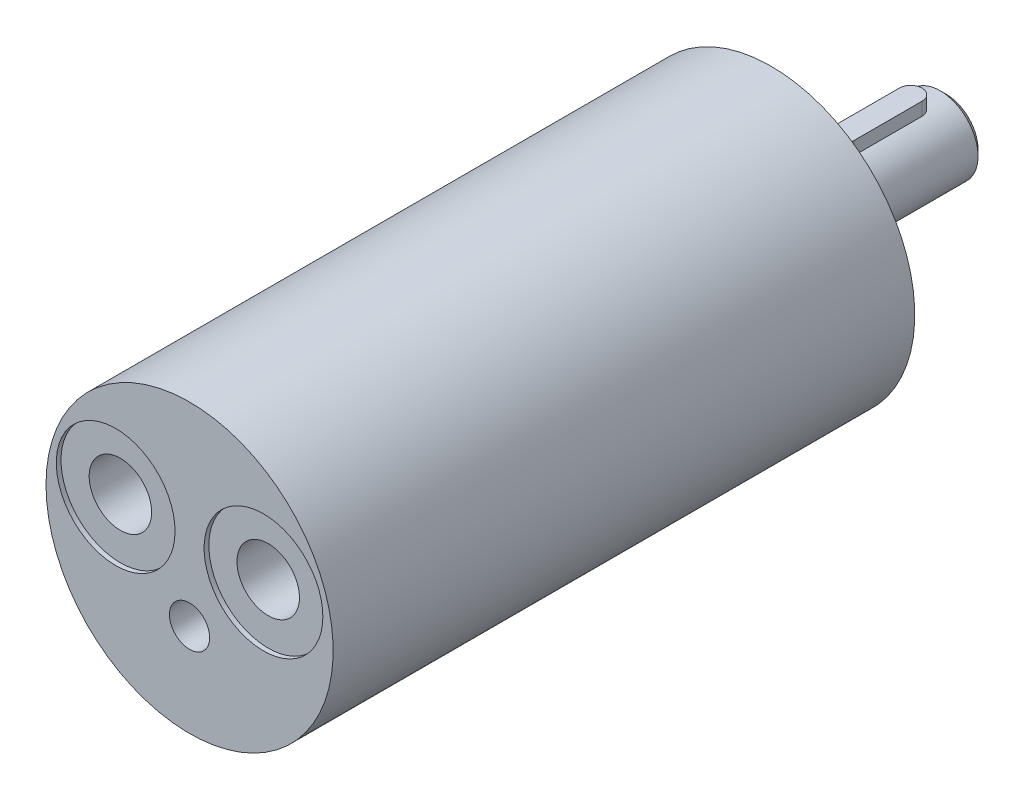
ISO-10303-21;
HEADER;
FILE_DESCRIPTION(('STEP AP214'),'2;1');
FILE_NAME('part.step','',(''),(''),'','','');
FILE_SCHEMA(('AUTOMOTIVE_DESIGN { 1 0 10303 214 1 1 1 1 }'));
ENDSEC;
DATA;
#1=APPLICATION_CONTEXT('core data for automotive mechanical design processes');
#2=APPLICATION_PROTOCOL_DEFINITION('international standard','automotive_design',2000,#1);
#3=PRODUCT_CONTEXT('',#1,'mechanical');
#4=PRODUCT('Part','Part','',(#3));
#5=PRODUCT_RELATED_PRODUCT_CATEGORY('part','',(#4));
#6=PRODUCT_DEFINITION_FORMATION('','',#4);
#7=PRODUCT_DEFINITION_CONTEXT('part definition',#1,'design');
#8=PRODUCT_DEFINITION('design','',#6,#7);
#9=PRODUCT_DEFINITION_SHAPE('','',#8);
#10=(LENGTH_UNIT() NAMED_UNIT(*) SI_UNIT(.MILLI.,.METRE.));
#11=(NAMED_UNIT(*) PLANE_ANGLE_UNIT() SI_UNIT($,.RADIAN.));
#12=(NAMED_UNIT(*) SI_UNIT($,.STERADIAN.) SOLID_ANGLE_UNIT());
#13=UNCERTAINTY_MEASURE_WITH_UNIT(LENGTH_MEASURE(1.E-05),#10,'distance_accuracy_value','');
#14=(GEOMETRIC_REPRESENTATION_CONTEXT(3) GLOBAL_UNCERTAINTY_ASSIGNED_CONTEXT((#13)) GLOBAL_UNIT_ASSIGNED_CONTEXT((#10,
#11,#12)) REPRESENTATION_CONTEXT('',''));
#15=CARTESIAN_POINT('',(0.,0.,0.));
#16=DIRECTION('',(0.,0.,1.));
#17=DIRECTION('',(1.,0.,0.));
#18=AXIS2_PLACEMENT_3D('',#15,#16,#17);
#19=CARTESIAN_POINT('',(0.,10.31875,-14.9542499999999));
#20=DIRECTION('',(0.,-1.,0.));
#21=DIRECTION('',(0.,0.,-1.));
#22=AXIS2_PLACEMENT_3D('',#19,#20,#21);
#23=CYLINDRICAL_SURFACE('',#22,2.38125);
#24=CARTESIAN_POINT('',(0.,5.55625,-14.9542499999999));
#25=DIRECTION('',(0.,1.,0.));
#26=DIRECTION('',(0.,0.,1.));
#27=AXIS2_PLACEMENT_3D('',#24,#25,#26);
#28=CIRCLE('',#27,2.38125);
#29=CARTESIAN_POINT('',(-2.38125,5.55625,-14.9542499999999));
#30=VERTEX_POINT('',#29);
#31=CARTESIAN_POINT('',(2.38125,5.55625,-14.9542499999999));
#32=VERTEX_POINT('',#31);
#33=EDGE_CURVE('E113',#30,#32,#28,.T.);
#34=ORIENTED_EDGE('',*,*,#33,.T.);
#35=DIRECTION('',(0.,-1.,0.));
#36=VECTOR('',#35,1.);
#37=CARTESIAN_POINT('',(2.38125,10.31875,-14.9542499999999));
#38=LINE('',#37,#36);
#39=CARTESIAN_POINT('',(2.38125,10.31875,-14.9542499999999));
#40=VERTEX_POINT('',#39);
#41=EDGE_CURVE('E12',#40,#32,#38,.T.);
#42=ORIENTED_EDGE('',*,*,#41,.F.);
#43=CARTESIAN_POINT('',(0.,10.31875,-14.9542499999999));
#44=DIRECTION('',(0.,1.,0.));
#45=DIRECTION('',(0.,0.,1.));
#46=AXIS2_PLACEMENT_3D('',#43,#44,#45);
#47=CIRCLE('',#46,2.38125);
#48=CARTESIAN_POINT('',(-2.38125,10.31875,-14.9542499999999));
#49=VERTEX_POINT('',#48);
#50=EDGE_CURVE('E101',#49,#40,#47,.T.);
#51=ORIENTED_EDGE('',*,*,#50,.F.);
#52=DIRECTION('',(0.,-1.,0.));
#53=VECTOR('',#52,1.);
#54=CARTESIAN_POINT('',(-2.38125,10.31875,-14.9542499999999));
#55=LINE('',#54,#53);
#56=EDGE_CURVE('E109',#49,#30,#55,.T.);
#57=ORIENTED_EDGE('',*,*,#56,.T.);
#58=EDGE_LOOP('',(#34,#42,#51,#57));
#59=FACE_BOUND('',#58,.T.);
#60=ADVANCED_FACE('F50',(#59),#23,.T.);
#61=CARTESIAN_POINT('',(2.38125,10.31875,-29.24175));
#62=DIRECTION('',(-1.,0.,0.));
#63=DIRECTION('',(0.,0.,1.));
#64=AXIS2_PLACEMENT_3D('',#61,#62,#63);
#65=PLANE('',#64);
#66=DIRECTION('',(0.,0.,-1.));
#67=VECTOR('',#66,1.);
#68=CARTESIAN_POINT('',(2.38125,5.55625,-29.24175));
#69=LINE('',#68,#67);
#70=CARTESIAN_POINT('',(2.38125,5.55625,-29.24175));
#71=VERTEX_POINT('',#70);
#72=EDGE_CURVE('E105',#32,#71,#69,.T.);
#73=ORIENTED_EDGE('',*,*,#72,.T.);
#74=DIRECTION('',(0.,-1.,0.));
#75=VECTOR('',#74,1.);
#76=CARTESIAN_POINT('',(2.38125,10.31875,-29.24175));
#77=LINE('',#76,#75);
#78=CARTESIAN_POINT('',(2.38125,10.31875,-29.24175));
#79=VERTEX_POINT('',#78);
#80=EDGE_CURVE('E58',#79,#71,#77,.T.);
#81=ORIENTED_EDGE('',*,*,#80,.F.);
#82=DIRECTION('',(0.,0.,-1.));
#83=VECTOR('',#82,1.);
#84=CARTESIAN_POINT('',(2.38125,10.31875,-29.24175));
#85=LINE('',#84,#83);
#86=EDGE_CURVE('E96',#40,#79,#85,.T.);
#87=ORIENTED_EDGE('',*,*,#86,.F.);
#88=ORIENTED_EDGE('',*,*,#41,.T.);
#89=EDGE_LOOP('',(#73,#81,#87,#88));
#90=FACE_BOUND('',#89,.T.);
#91=ADVANCED_FACE('F104',(#90),#65,.F.);
#92=CARTESIAN_POINT('',(0.,10.31875,-29.24175));
#93=DIRECTION('',(0.,-1.,0.));
#94=DIRECTION('',(0.,0.,-1.));
#95=AXIS2_PLACEMENT_3D('',#92,#93,#94);
#96=CYLINDRICAL_SURFACE('',#95,2.38125);
#97=CARTESIAN_POINT('',(0.,5.55625,-29.24175));
#98=DIRECTION('',(0.,1.,0.));
#99=DIRECTION('',(0.,0.,-1.));
#100=AXIS2_PLACEMENT_3D('',#97,#98,#99);
#101=CIRCLE('',#100,2.38125);
#102=CARTESIAN_POINT('',(-2.38125,5.55625,-29.24175));
#103=VERTEX_POINT('',#102);
#104=EDGE_CURVE('E83',#71,#103,#101,.T.);
#105=ORIENTED_EDGE('',*,*,#104,.T.);
#106=DIRECTION('',(0.,-1.,0.));
#107=VECTOR('',#106,1.);
#108=CARTESIAN_POINT('',(-2.38125,10.31875,-29.24175));
#109=LINE('',#108,#107);
#110=CARTESIAN_POINT('',(-2.38125,10.31875,-29.24175));
#111=VERTEX_POINT('',#110);
#112=EDGE_CURVE('E106',#111,#103,#109,.T.);
#113=ORIENTED_EDGE('',*,*,#112,.F.);
#114=CARTESIAN_POINT('',(0.,10.31875,-29.24175));
#115=DIRECTION('',(0.,1.,0.));
#116=DIRECTION('',(0.,0.,-1.));
#117=AXIS2_PLACEMENT_3D('',#114,#115,#116);
#118=CIRCLE('',#117,2.38125);
#119=EDGE_CURVE('E99',#79,#111,#118,.T.);
#120=ORIENTED_EDGE('',*,*,#119,.F.);
#121=ORIENTED_EDGE('',*,*,#80,.T.);
#122=EDGE_LOOP('',(#105,#113,#120,#121));
#123=FACE_BOUND('',#122,.T.);
#124=ADVANCED_FACE('F107',(#123),#96,.T.);
#125=CARTESIAN_POINT('',(-2.38125,10.31875,-29.24175));
#126=DIRECTION('',(1.,0.,0.));
#127=DIRECTION('',(0.,0.,-1.));
#128=AXIS2_PLACEMENT_3D('',#125,#126,#127);
#129=PLANE('',#128);
#130=DIRECTION('',(0.,0.,1.));
#131=VECTOR('',#130,1.);
#132=CARTESIAN_POINT('',(-2.38125,5.55625,-29.24175));
#133=LINE('',#132,#131);
#134=EDGE_CURVE('E89',#103,#30,#133,.T.);
#135=ORIENTED_EDGE('',*,*,#134,.T.);
#136=ORIENTED_EDGE('',*,*,#56,.F.);
#137=DIRECTION('',(0.,0.,1.));
#138=VECTOR('',#137,1.);
#139=CARTESIAN_POINT('',(-2.38125,10.31875,-29.24175));
#140=LINE('',#139,#138);
#141=EDGE_CURVE('E66',#111,#49,#140,.T.);
#142=ORIENTED_EDGE('',*,*,#141,.F.);
#143=ORIENTED_EDGE('',*,*,#112,.T.);
#144=EDGE_LOOP('',(#135,#136,#142,#143));
#145=FACE_BOUND('',#144,.T.);
#146=ADVANCED_FACE('F120',(#145),#129,.F.);
#147=CARTESIAN_POINT('',(0.,10.31875,-14.9542499999999));
#148=DIRECTION('',(0.,1.,0.));
#149=DIRECTION('',(0.,0.,1.));
#150=AXIS2_PLACEMENT_3D('',#147,#148,#149);
#151=PLANE('',#150);
#152=ORIENTED_EDGE('',*,*,#50,.T.);
#153=ORIENTED_EDGE('',*,*,#86,.T.);
#154=ORIENTED_EDGE('',*,*,#119,.T.);
#155=ORIENTED_EDGE('',*,*,#141,.T.);
#156=EDGE_LOOP('',(#152,#153,#154,#155));
#157=FACE_BOUND('',#156,.T.);
#158=ADVANCED_FACE('F97',(#157),#151,.T.);
#159=CARTESIAN_POINT('',(0.,5.55625,-14.9542499999999));
#160=DIRECTION('',(0.,1.,0.));
#161=DIRECTION('',(0.,0.,1.));
#162=AXIS2_PLACEMENT_3D('',#159,#160,#161);
#163=PLANE('',#162);
#164=ORIENTED_EDGE('',*,*,#33,.F.);
#165=ORIENTED_EDGE('',*,*,#134,.F.);
#166=ORIENTED_EDGE('',*,*,#104,.F.);
#167=ORIENTED_EDGE('',*,*,#72,.F.);
#168=EDGE_LOOP('',(#164,#165,#166,#167));
#169=FACE_BOUND('',#168,.T.);
#170=ADVANCED_FACE('F123',(#169),#163,.F.);
#171=CLOSED_SHELL('',(#60,#91,#124,#146,#158,#170));
#172=MANIFOLD_SOLID_BREP('B2',#171);
#173=CARTESIAN_POINT('',(0.,0.,121.92));
#174=DIRECTION('',(0.,0.,-1.));
#175=DIRECTION('',(-1.,0.,0.));
#176=AXIS2_PLACEMENT_3D('',#173,#174,#175);
#177=CYLINDRICAL_SURFACE('',#176,30.099);
#178=CARTESIAN_POINT('',(0.,0.,121.92));
#179=DIRECTION('',(0.,0.,1.));
#180=DIRECTION('',(1.,0.,0.));
#181=AXIS2_PLACEMENT_3D('',#178,#179,#180);
#182=CIRCLE('',#181,30.099);
#183=CARTESIAN_POINT('',(-30.099,0.,121.92));
#184=VERTEX_POINT('',#183);
#185=EDGE_CURVE('E322',#184,#184,#182,.T.);
#186=CARTESIAN_POINT('',(0.,0.,0.));
#187=DIRECTION('',(0.,0.,1.));
#188=DIRECTION('',(1.,0.,0.));
#189=AXIS2_PLACEMENT_3D('',#186,#187,#188);
#190=CIRCLE('',#189,30.099);
#191=CARTESIAN_POINT('',(-30.099,0.,0.));
#192=VERTEX_POINT('',#191);
#193=EDGE_CURVE('E321',#192,#192,#190,.T.);
#194=CARTESIAN_POINT('',(-30.099,0.,121.92));
#195=CARTESIAN_POINT('',(-30.099,0.,120.65));
#196=CARTESIAN_POINT('',(-30.099,0.,119.38));
#197=CARTESIAN_POINT('',(-30.099,0.,116.84));
#198=CARTESIAN_POINT('',(-30.099,0.,115.57));
#199=CARTESIAN_POINT('',(-30.099,0.,113.03));
#200=CARTESIAN_POINT('',(-30.099,0.,111.76));
#201=CARTESIAN_POINT('',(-30.099,0.,109.22));
#202=CARTESIAN_POINT('',(-30.099,0.,107.95));
#203=CARTESIAN_POINT('',(-30.099,0.,105.41));
#204=CARTESIAN_POINT('',(-30.099,0.,104.14));
#205=CARTESIAN_POINT('',(-30.099,0.,101.6));
#206=CARTESIAN_POINT('',(-30.099,0.,100.33));
#207=CARTESIAN_POINT('',(-30.099,0.,97.79));
#208=CARTESIAN_POINT('',(-30.099,0.,96.52));
#209=CARTESIAN_POINT('',(-30.099,0.,93.98));
#210=CARTESIAN_POINT('',(-30.099,0.,92.71));
#211=CARTESIAN_POINT('',(-30.099,0.,90.17));
#212=CARTESIAN_POINT('',(-30.099,0.,88.9));
#213=CARTESIAN_POINT('',(-30.099,0.,86.36));
#214=CARTESIAN_POINT('',(-30.099,0.,85.09));
#215=CARTESIAN_POINT('',(-30.099,0.,82.55));
#216=CARTESIAN_POINT('',(-30.099,0.,81.28));
#217=CARTESIAN_POINT('',(-30.099,0.,78.74));
#218=CARTESIAN_POINT('',(-30.099,0.,77.47));
#219=CARTESIAN_POINT('',(-30.099,0.,74.93));
#220=CARTESIAN_POINT('',(-30.099,0.,73.66));
#221=CARTESIAN_POINT('',(-30.099,0.,71.12));
#222=CARTESIAN_POINT('',(-30.099,0.,69.85));
#223=CARTESIAN_POINT('',(-30.099,0.,67.31));
#224=CARTESIAN_POINT('',(-30.099,0.,66.04));
#225=CARTESIAN_POINT('',(-30.099,0.,63.5));
#226=CARTESIAN_POINT('',(-30.099,0.,62.23));
#227=CARTESIAN_POINT('',(-30.099,0.,59.69));
#228=CARTESIAN_POINT('',(-30.099,0.,58.42));
#229=CARTESIAN_POINT('',(-30.099,0.,55.88));
#230=CARTESIAN_POINT('',(-30.099,0.,54.61));
#231=CARTESIAN_POINT('',(-30.099,0.,52.07));
#232=CARTESIAN_POINT('',(-30.099,0.,50.8));
#233=CARTESIAN_POINT('',(-30.099,0.,48.26));
#234=CARTESIAN_POINT('',(-30.099,0.,46.99));
#235=CARTESIAN_POINT('',(-30.099,0.,44.45));
#236=CARTESIAN_POINT('',(-30.099,0.,43.18));
#237=CARTESIAN_POINT('',(-30.099,0.,40.64));
#238=CARTESIAN_POINT('',(-30.099,0.,39.37));
#239=CARTESIAN_POINT('',(-30.099,0.,36.83));
#240=CARTESIAN_POINT('',(-30.099,0.,35.56));
#241=CARTESIAN_POINT('',(-30.099,0.,33.02));
#242=CARTESIAN_POINT('',(-30.099,0.,31.75));
#243=CARTESIAN_POINT('',(-30.099,0.,29.21));
#244=CARTESIAN_POINT('',(-30.099,0.,27.94));
#245=CARTESIAN_POINT('',(-30.099,0.,25.4));
#246=CARTESIAN_POINT('',(-30.099,0.,24.13));
#247=CARTESIAN_POINT('',(-30.099,0.,21.59));
#248=CARTESIAN_POINT('',(-30.099,0.,20.32));
#249=CARTESIAN_POINT('',(-30.099,0.,17.78));
#250=CARTESIAN_POINT('',(-30.099,0.,16.51));
#251=CARTESIAN_POINT('',(-30.099,0.,13.97));
#252=CARTESIAN_POINT('',(-30.099,0.,12.7));
#253=CARTESIAN_POINT('',(-30.099,0.,10.16));
#254=CARTESIAN_POINT('',(-30.099,0.,8.88999999999999));
#255=CARTESIAN_POINT('',(-30.099,0.,6.34999999999999));
#256=CARTESIAN_POINT('',(-30.099,0.,5.07999999999999));
#257=CARTESIAN_POINT('',(-30.099,0.,2.53999999999999));
#258=CARTESIAN_POINT('',(-30.099,0.,1.26999999999999));
#259=CARTESIAN_POINT('',(-30.099,0.,0.));
#260=B_SPLINE_CURVE_WITH_KNOTS('',3,(#194,#195,#196,#197,#198,#199,#200,#201,#202,#203,#204,
#205,#206,#207,#208,#209,#210,#211,#212,#213,#214,#215,#216,#217,#218,#219,#220,#221,#222,#223,
#224,#225,#226,#227,#228,#229,#230,#231,#232,#233,#234,#235,#236,#237,#238,#239,#240,#241,#242,
#243,#244,#245,#246,#247,#248,#249,#250,#251,#252,#253,#254,#255,#256,#257,#258,#259),
.UNSPECIFIED.,.F.,.F.,(4,2,2,2,2,2,2,2,2,2,2,2,2,2,2,2,2,2,2,2,2,2,2,2,2,2,2,2,2,2,2,2,4),(0.,
3.80999999999999,7.62,11.43,15.24,19.05,22.86,26.67,30.48,34.29,38.1,41.91,45.72,49.53,53.34,
57.15,60.96,64.77,68.58,72.39,76.2,80.01,83.82,87.63,91.44,95.25,99.06,102.87,106.68,110.49,
114.3,118.11,121.92),.UNSPECIFIED.);
#261=EDGE_CURVE('BSEAM162',#184,#192,#260,.T.);
#262=ORIENTED_EDGE('',*,*,#185,.F.);
#263=ORIENTED_EDGE('',*,*,#193,.T.);
#264=ORIENTED_EDGE('',*,*,#261,.T.);
#265=ORIENTED_EDGE('',*,*,#261,.F.);
#266=EDGE_LOOP('',(#262,#264,#263,#265));
#267=FACE_BOUND('',#266,.T.);
#268=ADVANCED_FACE('F162',(#267),#177,.T.);
#269=CARTESIAN_POINT('',(0.,0.,121.92));
#270=DIRECTION('',(0.,0.,1.));
#271=DIRECTION('',(1.,0.,0.));
#272=AXIS2_PLACEMENT_3D('',#269,#270,#271);
#273=PLANE('',#272);
#274=CARTESIAN_POINT('',(0.,-10.5918,121.92));
#275=DIRECTION('',(0.,0.,1.));
#276=DIRECTION('',(1.,0.,0.));
#277=AXIS2_PLACEMENT_3D('',#274,#275,#276);
#278=CIRCLE('',#277,4.2164);
#279=CARTESIAN_POINT('',(4.2164,-10.5918,121.92));
#280=VERTEX_POINT('',#279);
#281=EDGE_CURVE('E247',#280,#280,#278,.T.);
#282=ORIENTED_EDGE('',*,*,#281,.F.);
#283=EDGE_LOOP('',(#282));
#284=FACE_BOUND('',#283,.T.);
#285=CARTESIAN_POINT('',(15.494,5.1054,121.92));
#286=DIRECTION('',(0.,0.,1.));
#287=DIRECTION('',(1.,0.,0.));
#288=AXIS2_PLACEMENT_3D('',#285,#286,#287);
#289=CIRCLE('',#288,12.446);
#290=CARTESIAN_POINT('',(27.94,5.1054,121.92));
#291=VERTEX_POINT('',#290);
#292=EDGE_CURVE('E253',#291,#291,#289,.T.);
#293=ORIENTED_EDGE('',*,*,#292,.F.);
#294=EDGE_LOOP('',(#293));
#295=FACE_BOUND('',#294,.T.);
#296=CARTESIAN_POINT('',(-15.494,5.1054,121.92));
#297=DIRECTION('',(0.,0.,1.));
#298=DIRECTION('',(1.,0.,0.));
#299=AXIS2_PLACEMENT_3D('',#296,#297,#298);
#300=CIRCLE('',#299,12.446);
#301=CARTESIAN_POINT('',(-3.048,5.1054,121.92));
#302=VERTEX_POINT('',#301);
#303=EDGE_CURVE('E263',#302,#302,#300,.T.);
#304=ORIENTED_EDGE('',*,*,#303,.F.);
#305=EDGE_LOOP('',(#304));
#306=FACE_BOUND('',#305,.T.);
#307=ORIENTED_EDGE('',*,*,#185,.T.);
#308=EDGE_LOOP('',(#307));
#309=FACE_BOUND('',#308,.T.);
#310=ADVANCED_FACE('F390',(#284,#295,#306,#309),#273,.T.);
#311=CARTESIAN_POINT('',(0.,0.,0.));
#312=DIRECTION('',(0.,0.,1.));
#313=DIRECTION('',(1.,0.,0.));
#314=AXIS2_PLACEMENT_3D('',#311,#312,#313);
#315=PLANE('',#314);
#316=CARTESIAN_POINT('',(0.,22.5044,0.));
#317=DIRECTION('',(0.,0.,-1.));
#318=DIRECTION('',(-1.,0.,0.));
#319=AXIS2_PLACEMENT_3D('',#316,#317,#318);
#320=CIRCLE('',#319,2.7051);
#321=CARTESIAN_POINT('',(-2.7051,22.5044,0.));
#322=VERTEX_POINT('',#321);
#323=EDGE_CURVE('E272',#322,#322,#320,.T.);
#324=ORIENTED_EDGE('',*,*,#323,.F.);
#325=EDGE_LOOP('',(#324));
#326=FACE_BOUND('',#325,.T.);
#327=CARTESIAN_POINT('',(-15.9130138465345,-15.9130138465346,0.));
#328=DIRECTION('',(0.,0.,-1.));
#329=DIRECTION('',(-1.,0.,0.));
#330=AXIS2_PLACEMENT_3D('',#327,#328,#329);
#331=CIRCLE('',#330,2.7051);
#332=CARTESIAN_POINT('',(-18.6181138465345,-15.9130138465346,0.));
#333=VERTEX_POINT('',#332);
#334=EDGE_CURVE('E278',#333,#333,#331,.T.);
#335=ORIENTED_EDGE('',*,*,#334,.F.);
#336=EDGE_LOOP('',(#335));
#337=FACE_BOUND('',#336,.T.);
#338=CARTESIAN_POINT('',(15.9130138465345,-15.9130138465346,0.));
#339=DIRECTION('',(0.,0.,-1.));
#340=DIRECTION('',(-1.,0.,0.));
#341=AXIS2_PLACEMENT_3D('',#338,#339,#340);
#342=CIRCLE('',#341,2.7051);
#343=CARTESIAN_POINT('',(13.2079138465345,-15.9130138465346,0.));
#344=VERTEX_POINT('',#343);
#345=EDGE_CURVE('E284',#344,#344,#342,.T.);
#346=ORIENTED_EDGE('',*,*,#345,.F.);
#347=EDGE_LOOP('',(#346));
#348=FACE_BOUND('',#347,.T.);
#349=CARTESIAN_POINT('',(0.,0.,0.));
#350=DIRECTION('',(0.,0.,-1.));
#351=DIRECTION('',(-1.,0.,0.));
#352=AXIS2_PLACEMENT_3D('',#349,#350,#351);
#353=CIRCLE('',#352,15.748);
#354=CARTESIAN_POINT('',(-15.748,0.,0.));
#355=VERTEX_POINT('',#354);
#356=EDGE_CURVE('E318',#355,#355,#353,.T.);
#357=ORIENTED_EDGE('',*,*,#356,.F.);
#358=EDGE_LOOP('',(#357));
#359=FACE_BOUND('',#358,.T.);
#360=ORIENTED_EDGE('',*,*,#193,.F.);
#361=EDGE_LOOP('',(#360));
#362=FACE_BOUND('',#361,.T.);
#363=ADVANCED_FACE('F395',(#326,#337,#348,#359,#362),#315,.F.);
#364=CARTESIAN_POINT('',(0.,0.,0.));
#365=DIRECTION('',(0.,0.,-1.));
#366=DIRECTION('',(-1.,0.,0.));
#367=AXIS2_PLACEMENT_3D('',#364,#365,#366);
#368=CYLINDRICAL_SURFACE('',#367,15.748);
#369=ORIENTED_EDGE('',*,*,#356,.T.);
#370=EDGE_LOOP('',(#369));
#371=FACE_BOUND('',#370,.T.);
#372=CARTESIAN_POINT('',(0.,0.,-5.07999999999997));
#373=DIRECTION('',(0.,0.,-1.));
#374=DIRECTION('',(-1.,0.,0.));
#375=AXIS2_PLACEMENT_3D('',#372,#373,#374);
#376=CIRCLE('',#375,15.748);
#377=CARTESIAN_POINT('',(-15.748,0.,-5.07999999999997));
#378=VERTEX_POINT('',#377);
#379=EDGE_CURVE('E315',#378,#378,#376,.T.);
#380=ORIENTED_EDGE('',*,*,#379,.F.);
#381=EDGE_LOOP('',(#380));
#382=FACE_BOUND('',#381,.T.);
#383=ADVANCED_FACE('F402',(#371,#382),#368,.T.);
#384=CARTESIAN_POINT('',(0.,15.748,-5.07999999999997));
#385=DIRECTION('',(0.,0.,-1.));
#386=DIRECTION('',(-1.,0.,0.));
#387=AXIS2_PLACEMENT_3D('',#384,#385,#386);
#388=PLANE('',#387);
#389=ORIENTED_EDGE('',*,*,#379,.T.);
#390=EDGE_LOOP('',(#389));
#391=FACE_BOUND('',#390,.T.);
#392=CARTESIAN_POINT('',(0.,0.,-5.07999999999997));
#393=DIRECTION('',(0.,0.,-1.));
#394=DIRECTION('',(-1.,0.,0.));
#395=AXIS2_PLACEMENT_3D('',#392,#393,#394);
#396=CIRCLE('',#395,7.9375);
#397=CARTESIAN_POINT('',(-7.9375,0.,-5.07999999999997));
#398=VERTEX_POINT('',#397);
#399=EDGE_CURVE('E305',#398,#398,#396,.T.);
#400=ORIENTED_EDGE('',*,*,#399,.F.);
#401=EDGE_LOOP('',(#400));
#402=FACE_BOUND('',#401,.T.);
#403=ADVANCED_FACE('F406',(#391,#402),#388,.T.);
#404=CARTESIAN_POINT('',(0.,0.,0.));
#405=DIRECTION('',(0.,0.,-1.));
#406=DIRECTION('',(-1.,0.,0.));
#407=AXIS2_PLACEMENT_3D('',#404,#405,#406);
#408=CYLINDRICAL_SURFACE('',#407,7.9375);
#409=CARTESIAN_POINT('',(-2.38125,7.571892411247,-14.9542499999999));
#410=CARTESIAN_POINT('',(-2.38125815852546,7.57188330559514,-14.8888961803469));
#411=CARTESIAN_POINT('',(-2.378559685058,7.572738315761,-14.8235475887935));
#412=CARTESIAN_POINT('',(-2.36781294676357,7.57610889609126,-14.6933491749924));
#413=CARTESIAN_POINT('',(-2.35976588470551,7.57862409291873,-14.6284992439238));
#414=CARTESIAN_POINT('',(-2.3384124287113,7.58523905503608,-14.4999194731844));
#415=CARTESIAN_POINT('',(-2.32511938897705,7.58933479629778,-14.4361872152908));
#416=CARTESIAN_POINT('',(-2.29340452092877,7.59897853654372,-14.3101410487185));
#417=CARTESIAN_POINT('',(-2.27498255848908,7.6045265735065,-14.2478271771778));
#418=CARTESIAN_POINT('',(-2.21224938904031,7.62310862387971,-14.0637026732828));
#419=CARTESIAN_POINT('',(-2.16044345455985,7.63808962465372,-13.9445456766763));
#420=CARTESIAN_POINT('',(-2.03846940802952,7.67153988586956,-13.7166143275916));
#421=CARTESIAN_POINT('',(-1.96829275127302,7.69001076843195,-13.6078448388325));
#422=CARTESIAN_POINT('',(-1.80919341959839,7.72901085096578,-13.4003073783164));
#423=CARTESIAN_POINT('',(-1.71979363580102,7.74958369966712,-13.3019126312141));
#424=CARTESIAN_POINT('',(-1.52580765569407,7.79009767602092,-13.1212640682217));
#425=CARTESIAN_POINT('',(-1.42121889879479,7.81003869646656,-13.0390129793728));
#426=CARTESIAN_POINT('',(-1.19714960488397,7.84754016893874,-12.8913518008312));
#427=CARTESIAN_POINT('',(-1.07740582874559,7.86504286102833,-12.8263251697975));
#428=CARTESIAN_POINT('',(-0.828073603948429,7.89518471194964,-12.7174807530726));
#429=CARTESIAN_POINT('',(-0.69848770377109,7.90782512469469,-12.6736574985767));
#430=CARTESIAN_POINT('',(-0.437077965076343,7.92650878316165,-12.6097033557659));
#431=CARTESIAN_POINT('',(-0.305424088331612,7.93273034455641,-12.5889307978328));
#432=CARTESIAN_POINT('',(-0.040359918620344,7.93850333232182,-12.5696387107278));
#433=CARTESIAN_POINT('',(0.0930500370432332,7.93805602147906,-12.5711149686242));
#434=CARTESIAN_POINT('',(0.353332414422018,7.93066744068433,-12.5958487451738));
#435=CARTESIAN_POINT('',(0.480277718293171,7.92393347119356,-12.6184109858289));
#436=CARTESIAN_POINT('',(0.728487957843948,7.90498028000196,-12.6835402202652));
#437=CARTESIAN_POINT('',(0.849752595567599,7.89276077093468,-12.7261082620794));
#438=CARTESIAN_POINT('',(1.08481465769293,7.86392278694851,-12.8305119020478));
#439=CARTESIAN_POINT('',(1.19850853458546,7.84725468411775,-12.892566360466));
#440=CARTESIAN_POINT('',(1.41409027820908,7.81128779134769,-13.0340077616523));
#441=CARTESIAN_POINT('',(1.5159754916908,7.79198841230746,-13.1133985881592));
#442=CARTESIAN_POINT('',(1.70918902734001,7.75194781794581,-13.2908547810966));
#443=CARTESIAN_POINT('',(1.79996070471309,7.73117969651157,-13.3895208837239));
#444=CARTESIAN_POINT('',(1.96384496569401,7.69118691494527,-13.6009021596881));
#445=CARTESIAN_POINT('',(2.03695239695781,7.67196270623387,-13.7136214175793));
#446=CARTESIAN_POINT('',(2.1640229649485,7.63710100713096,-13.9513959739143));
#447=CARTESIAN_POINT('',(2.21778522566548,7.62150171540441,-14.0765643976048));
#448=CARTESIAN_POINT('',(2.30323844032467,7.59611866049456,-14.3346876500708));
#449=CARTESIAN_POINT('',(2.33496315483632,7.58632600517951,-14.467630228884));
#450=CARTESIAN_POINT('',(2.36380660699251,7.57736026315946,-14.660554386399));
#451=CARTESIAN_POINT('',(2.37034709745051,7.57531435586985,-14.7191265405101));
#452=CARTESIAN_POINT('',(2.37906489538582,7.57258024171203,-14.8365392230705));
#453=CARTESIAN_POINT('',(2.38124861837128,7.57189003854046,-14.8953792288413));
#454=CARTESIAN_POINT('',(2.38125,7.571892411247,-14.9542499999999));
#455=B_SPLINE_CURVE_WITH_KNOTS('',3,(#409,#410,#411,#412,#413,#414,#415,#416,#417,#418,#419,
#420,#421,#422,#423,#424,#425,#426,#427,#428,#429,#430,#431,#432,#433,#434,#435,#436,#437,#438,
#439,#440,#441,#442,#443,#444,#445,#446,#447,#448,#449,#450,#451,#452,#453,#454),.UNSPECIFIED.,
.F.,.F.,(4,2,2,2,2,2,2,2,2,2,2,2,2,2,2,2,2,2,2,2,2,2,4),(0.,0.195991275561311,0.391938492304166,
0.587390088888212,0.782846797176293,1.17326844500354,1.56387201187681,1.96560376359319,
2.36740331889729,2.77751230929677,3.18751546734635,3.58579420686403,3.98399753113253,
4.36951721861803,4.75505710436408,5.14509213034555,5.53521462280467,5.94033955159904,
6.34558250580856,6.75491961154771,7.16362823927552,7.3403957500019,7.51690277106329),.UNSPECIFIED.);
#456=CARTESIAN_POINT('',(-2.38125,7.571892411247,-14.9542499999999));
#457=VERTEX_POINT('',#456);
#458=CARTESIAN_POINT('',(2.38125,7.571892411247,-14.9542499999999));
#459=VERTEX_POINT('',#458);
#460=EDGE_CURVE('E333',#457,#459,#455,.T.);
#461=ORIENTED_EDGE('',*,*,#460,.F.);
#462=DIRECTION('',(0.,0.,-1.));
#463=VECTOR('',#462,1.);
#464=CARTESIAN_POINT('',(-2.38125,7.571892411247,0.));
#465=LINE('',#464,#463);
#466=CARTESIAN_POINT('',(-2.38125,7.571892411247,-29.24175));
#467=VERTEX_POINT('',#466);
#468=EDGE_CURVE('E48',#467,#457,#465,.F.);
#469=ORIENTED_EDGE('',*,*,#468,.F.);
#470=CARTESIAN_POINT('',(2.38125,7.571892411247,-29.24175));
#471=CARTESIAN_POINT('',(2.38125815852546,7.57188330559514,-29.307103819653));
#472=CARTESIAN_POINT('',(2.378559685058,7.572738315761,-29.3724524112064));
#473=CARTESIAN_POINT('',(2.36781294676356,7.57610889609126,-29.5026508250076));
#474=CARTESIAN_POINT('',(2.35976588470551,7.57862409291873,-29.5675007560762));
#475=CARTESIAN_POINT('',(2.33841242871129,7.58523905503609,-29.6960805268156));
#476=CARTESIAN_POINT('',(2.32511938897703,7.58933479629778,-29.7598127847091));
#477=CARTESIAN_POINT('',(2.29340452092875,7.59897853654373,-29.8858589512815));
#478=CARTESIAN_POINT('',(2.27498255848908,7.6045265735065,-29.9481728228222));
#479=CARTESIAN_POINT('',(2.21224938904032,7.6231086238797,-30.1322973267172));
#480=CARTESIAN_POINT('',(2.16044345455983,7.63808962465372,-30.2514543233237));
#481=CARTESIAN_POINT('',(2.03846940802949,7.67153988586956,-30.4793856724083));
#482=CARTESIAN_POINT('',(1.96829275127302,7.69001076843196,-30.5881551611674));
#483=CARTESIAN_POINT('',(1.80919341959838,7.72901085096578,-30.7956926216835));
#484=CARTESIAN_POINT('',(1.71979363580099,7.74958369966712,-30.8940873687858));
#485=CARTESIAN_POINT('',(1.52580765569405,7.79009767602092,-31.0747359317782));
#486=CARTESIAN_POINT('',(1.4212188987948,7.81003869646656,-31.1569870206272));
#487=CARTESIAN_POINT('',(1.19714960488398,7.84754016893874,-31.3046481991688));
#488=CARTESIAN_POINT('',(1.07740582874555,7.86504286102834,-31.3696748302024));
#489=CARTESIAN_POINT('',(0.828073603948389,7.89518471194964,-31.4785192469273));
#490=CARTESIAN_POINT('',(0.698487703771084,7.90782512469469,-31.5223425014233));
#491=CARTESIAN_POINT('',(0.437077965076355,7.92650878316165,-31.5862966442341));
#492=CARTESIAN_POINT('',(0.305424088331611,7.93273034455641,-31.6070692021671));
#493=CARTESIAN_POINT('',(0.0403599186203326,7.93850333232182,-31.6263612892721));
#494=CARTESIAN_POINT('',(-0.0930500370432424,7.93805602147906,-31.6248850313758));
#495=CARTESIAN_POINT('',(-0.353332414422004,7.93066744068434,-31.6001512548262));
#496=CARTESIAN_POINT('',(-0.480277718293135,7.92393347119356,-31.577589014171));
#497=CARTESIAN_POINT('',(-0.728487957843923,7.90498028000196,-31.5124597797347));
#498=CARTESIAN_POINT('',(-0.849752595567604,7.89276077093468,-31.4698917379206));
#499=CARTESIAN_POINT('',(-1.08481465769292,7.86392278694852,-31.3654880979523));
#500=CARTESIAN_POINT('',(-1.19850853458541,7.84725468411776,-31.303433639534));
#501=CARTESIAN_POINT('',(-1.41409027820902,7.8112877913477,-31.1619922383477));
#502=CARTESIAN_POINT('',(-1.5159754916908,7.79198841230746,-31.0826014118408));
#503=CARTESIAN_POINT('',(-1.70918902734001,7.75194781794581,-30.9051452189034));
#504=CARTESIAN_POINT('',(-1.79996070471304,7.73117969651158,-30.806479116276));
#505=CARTESIAN_POINT('',(-1.96384496569395,7.69118691494528,-30.5950978403119));
#506=CARTESIAN_POINT('',(-2.0369523969578,7.67196270623387,-30.4823785824207));
#507=CARTESIAN_POINT('',(-2.16402296494851,7.63710100713096,-30.2446040260857));
#508=CARTESIAN_POINT('',(-2.21778522566545,7.62150171540442,-30.1194356023952));
#509=CARTESIAN_POINT('',(-2.30323844032464,7.59611866049457,-29.8613123499292));
#510=CARTESIAN_POINT('',(-2.33496315483632,7.58632600517951,-29.728369771116));
#511=CARTESIAN_POINT('',(-2.36380660699251,7.57736026315946,-29.535445613601));
#512=CARTESIAN_POINT('',(-2.37034709745051,7.57531435586985,-29.4768734594898));
#513=CARTESIAN_POINT('',(-2.37906489538581,7.57258024171204,-29.3594607769295));
#514=CARTESIAN_POINT('',(-2.38124861837127,7.57189003854047,-29.3006207711586));
#515=CARTESIAN_POINT('',(-2.38125,7.571892411247,-29.24175));
#516=B_SPLINE_CURVE_WITH_KNOTS('',3,(#470,#471,#472,#473,#474,#475,#476,#477,#478,#479,#480,
#481,#482,#483,#484,#485,#486,#487,#488,#489,#490,#491,#492,#493,#494,#495,#496,#497,#498,#499,
#500,#501,#502,#503,#504,#505,#506,#507,#508,#509,#510,#511,#512,#513,#514,#515),.UNSPECIFIED.,
.F.,.F.,(4,2,2,2,2,2,2,2,2,2,2,2,2,2,2,2,2,2,2,2,2,2,4),(0.,0.195991275561337,0.391938492304235,
0.5873900888883,0.782846797176398,1.17326844500359,1.56387201187681,1.96560376359323,
2.36740331889736,2.77751230929683,3.18751546734641,3.58579420686408,3.98399753113256,
4.36951721861805,4.7550571043641,5.14509213034556,5.53521462280467,5.94033955159904,
6.34558250580855,6.75491961154771,7.1636282392755,7.34039575000194,7.51690277106339),.UNSPECIFIED.);
#517=CARTESIAN_POINT('',(2.38125,7.571892411247,-29.24175));
#518=VERTEX_POINT('',#517);
#519=EDGE_CURVE('E171',#518,#467,#516,.T.);
#520=ORIENTED_EDGE('',*,*,#519,.F.);
#521=DIRECTION('',(0.,0.,-1.));
#522=VECTOR('',#521,1.);
#523=CARTESIAN_POINT('',(2.38125,7.571892411247,0.));
#524=LINE('',#523,#522);
#525=EDGE_CURVE('E340',#459,#518,#524,.T.);
#526=ORIENTED_EDGE('',*,*,#525,.F.);
#527=EDGE_LOOP('',(#461,#469,#520,#526));
#528=FACE_BOUND('',#527,.T.);
#529=CARTESIAN_POINT('',(0.,0.,-35.433));
#530=DIRECTION('',(0.,0.,-1.));
#531=DIRECTION('',(-1.,0.,0.));
#532=AXIS2_PLACEMENT_3D('',#529,#530,#531);
#533=CIRCLE('',#532,7.9375);
#534=CARTESIAN_POINT('',(-7.9375,0.,-35.433));
#535=VERTEX_POINT('',#534);
#536=EDGE_CURVE('E330',#535,#535,#533,.F.);
#537=ORIENTED_EDGE('',*,*,#536,.T.);
#538=EDGE_LOOP('',(#537));
#539=FACE_BOUND('',#538,.T.);
#540=ORIENTED_EDGE('',*,*,#399,.T.);
#541=EDGE_LOOP('',(#540));
#542=FACE_BOUND('',#541,.T.);
#543=ADVANCED_FACE('F342',(#528,#539,#542),#408,.T.);
#544=CARTESIAN_POINT('',(0.,7.9375,-36.703));
#545=DIRECTION('',(0.,0.,-1.));
#546=DIRECTION('',(-1.,0.,0.));
#547=AXIS2_PLACEMENT_3D('',#544,#545,#546);
#548=PLANE('',#547);
#549=CARTESIAN_POINT('',(0.,0.,-36.703));
#550=DIRECTION('',(0.,0.,-1.));
#551=DIRECTION('',(-1.,0.,0.));
#552=AXIS2_PLACEMENT_3D('',#549,#550,#551);
#553=CIRCLE('',#552,3.96875);
#554=CARTESIAN_POINT('',(-3.96875,0.,-36.703));
#555=VERTEX_POINT('',#554);
#556=EDGE_CURVE('E241',#555,#555,#553,.T.);
#557=ORIENTED_EDGE('',*,*,#556,.F.);
#558=EDGE_LOOP('',(#557));
#559=FACE_BOUND('',#558,.T.);
#560=CARTESIAN_POINT('',(0.,0.,-36.703));
#561=DIRECTION('',(0.,0.,-1.));
#562=DIRECTION('',(-1.,0.,0.));
#563=AXIS2_PLACEMENT_3D('',#560,#561,#562);
#564=CIRCLE('',#563,6.66750000000002);
#565=CARTESIAN_POINT('',(-6.66750000000002,0.,-36.703));
#566=VERTEX_POINT('',#565);
#567=EDGE_CURVE('E325',#566,#566,#564,.T.);
#568=ORIENTED_EDGE('',*,*,#567,.T.);
#569=EDGE_LOOP('',(#568));
#570=FACE_BOUND('',#569,.T.);
#571=ADVANCED_FACE('F362',(#559,#570),#548,.T.);
#572=CARTESIAN_POINT('',(0.,0.,-36.703));
#573=DIRECTION('',(0.,0.,1.));
#574=DIRECTION('',(1.,0.,0.));
#575=AXIS2_PLACEMENT_3D('',#572,#573,#574);
#576=CONICAL_SURFACE('',#575,6.66750000000002,0.785398163397444);
#577=ORIENTED_EDGE('',*,*,#536,.F.);
#578=EDGE_LOOP('',(#577));
#579=FACE_BOUND('',#578,.T.);
#580=ORIENTED_EDGE('',*,*,#567,.F.);
#581=EDGE_LOOP('',(#580));
#582=FACE_BOUND('',#581,.T.);
#583=ADVANCED_FACE('F164',(#579,#582),#576,.T.);
#584=CARTESIAN_POINT('',(0.,5.55625,-29.24175));
#585=DIRECTION('',(0.,1.,0.));
#586=DIRECTION('',(0.,0.,1.));
#587=AXIS2_PLACEMENT_3D('',#584,#585,#586);
#588=CYLINDRICAL_SURFACE('',#587,2.38125);
#589=DIRECTION('',(0.,1.,0.));
#590=VECTOR('',#589,1.);
#591=CARTESIAN_POINT('',(2.38125,5.55625,-29.24175));
#592=LINE('',#591,#590);
#593=CARTESIAN_POINT('',(2.38125,5.55625,-29.24175));
#594=VERTEX_POINT('',#593);
#595=EDGE_CURVE('E302',#594,#518,#592,.T.);
#596=ORIENTED_EDGE('',*,*,#595,.T.);
#597=ORIENTED_EDGE('',*,*,#519,.T.);
#598=DIRECTION('',(0.,1.,0.));
#599=VECTOR('',#598,1.);
#600=CARTESIAN_POINT('',(-2.38125,5.55625,-29.24175));
#601=LINE('',#600,#599);
#602=CARTESIAN_POINT('',(-2.38125,5.55625,-29.24175));
#603=VERTEX_POINT('',#602);
#604=EDGE_CURVE('E178',#603,#467,#601,.T.);
#605=ORIENTED_EDGE('',*,*,#604,.F.);
#606=CARTESIAN_POINT('',(0.,5.55625,-29.24175));
#607=DIRECTION('',(0.,1.,0.));
#608=DIRECTION('',(0.,0.,1.));
#609=AXIS2_PLACEMENT_3D('',#606,#607,#608);
#610=CIRCLE('',#609,2.38125);
#611=EDGE_CURVE('E290',#594,#603,#610,.T.);
#612=ORIENTED_EDGE('',*,*,#611,.F.);
#613=EDGE_LOOP('',(#596,#597,#605,#612));
#614=FACE_BOUND('',#613,.T.);
#615=ADVANCED_FACE('F358',(#614),#588,.F.);
#616=CARTESIAN_POINT('',(2.38125,5.55625,-29.24175));
#617=DIRECTION('',(1.,0.,0.));
#618=DIRECTION('',(0.,0.,-1.));
#619=AXIS2_PLACEMENT_3D('',#616,#617,#618);
#620=PLANE('',#619);
#621=ORIENTED_EDGE('',*,*,#525,.T.);
#622=ORIENTED_EDGE('',*,*,#595,.F.);
#623=DIRECTION('',(0.,0.,-1.));
#624=VECTOR('',#623,1.);
#625=CARTESIAN_POINT('',(2.38125,5.55625,-29.24175));
#626=LINE('',#625,#624);
#627=CARTESIAN_POINT('',(2.38125,5.55625,-14.9542499999999));
#628=VERTEX_POINT('',#627);
#629=EDGE_CURVE('E299',#628,#594,#626,.T.);
#630=ORIENTED_EDGE('',*,*,#629,.F.);
#631=DIRECTION('',(0.,1.,0.));
#632=VECTOR('',#631,1.);
#633=CARTESIAN_POINT('',(2.38125,5.55625,-14.9542499999999));
#634=LINE('',#633,#632);
#635=EDGE_CURVE('E306',#628,#459,#634,.T.);
#636=ORIENTED_EDGE('',*,*,#635,.T.);
#637=EDGE_LOOP('',(#621,#622,#630,#636));
#638=FACE_BOUND('',#637,.T.);
#639=ADVANCED_FACE('F352',(#638),#620,.F.);
#640=CARTESIAN_POINT('',(0.,5.55625,-14.9542499999999));
#641=DIRECTION('',(0.,1.,0.));
#642=DIRECTION('',(0.,0.,1.));
#643=AXIS2_PLACEMENT_3D('',#640,#641,#642);
#644=CYLINDRICAL_SURFACE('',#643,2.38125);
#645=DIRECTION('',(0.,1.,0.));
#646=VECTOR('',#645,1.);
#647=CARTESIAN_POINT('',(-2.38125,5.55625,-14.9542499999999));
#648=LINE('',#647,#646);
#649=CARTESIAN_POINT('',(-2.38125,5.55625,-14.9542499999999));
#650=VERTEX_POINT('',#649);
#651=EDGE_CURVE('E309',#650,#457,#648,.T.);
#652=ORIENTED_EDGE('',*,*,#651,.T.);
#653=ORIENTED_EDGE('',*,*,#460,.T.);
#654=ORIENTED_EDGE('',*,*,#635,.F.);
#655=CARTESIAN_POINT('',(0.,5.55625,-14.9542499999999));
#656=DIRECTION('',(0.,1.,0.));
#657=DIRECTION('',(0.,0.,1.));
#658=AXIS2_PLACEMENT_3D('',#655,#656,#657);
#659=CIRCLE('',#658,2.38125);
#660=EDGE_CURVE('E296',#650,#628,#659,.T.);
#661=ORIENTED_EDGE('',*,*,#660,.F.);
#662=EDGE_LOOP('',(#652,#653,#654,#661));
#663=FACE_BOUND('',#662,.T.);
#664=ADVANCED_FACE('F346',(#663),#644,.F.);
#665=CARTESIAN_POINT('',(-2.38125,5.55625,-29.24175));
#666=DIRECTION('',(-1.,0.,0.));
#667=DIRECTION('',(0.,0.,1.));
#668=AXIS2_PLACEMENT_3D('',#665,#666,#667);
#669=PLANE('',#668);
#670=ORIENTED_EDGE('',*,*,#468,.T.);
#671=ORIENTED_EDGE('',*,*,#651,.F.);
#672=DIRECTION('',(0.,0.,1.));
#673=VECTOR('',#672,1.);
#674=CARTESIAN_POINT('',(-2.38125,5.55625,-29.24175));
#675=LINE('',#674,#673);
#676=EDGE_CURVE('E293',#603,#650,#675,.T.);
#677=ORIENTED_EDGE('',*,*,#676,.F.);
#678=ORIENTED_EDGE('',*,*,#604,.T.);
#679=EDGE_LOOP('',(#670,#671,#677,#678));
#680=FACE_BOUND('',#679,.T.);
#681=ADVANCED_FACE('F351',(#680),#669,.F.);
#682=CARTESIAN_POINT('',(0.,5.55625,-29.24175));
#683=DIRECTION('',(0.,1.,0.));
#684=DIRECTION('',(0.,0.,1.));
#685=AXIS2_PLACEMENT_3D('',#682,#683,#684);
#686=PLANE('',#685);
#687=ORIENTED_EDGE('',*,*,#611,.T.);
#688=ORIENTED_EDGE('',*,*,#676,.T.);
#689=ORIENTED_EDGE('',*,*,#660,.T.);
#690=ORIENTED_EDGE('',*,*,#629,.T.);
#691=EDGE_LOOP('',(#687,#688,#689,#690));
#692=FACE_BOUND('',#691,.T.);
#693=ADVANCED_FACE('F357',(#692),#686,.T.);
#694=CARTESIAN_POINT('',(15.9130138465345,-15.9130138465346,11.1251999999999));
#695=DIRECTION('',(0.,0.,-1.));
#696=DIRECTION('',(-1.,0.,0.));
#697=AXIS2_PLACEMENT_3D('',#694,#695,#696);
#698=CONICAL_SURFACE('',#697,2.7051,1.02974425867665);
#699=CARTESIAN_POINT('',(15.9130138465345,-15.9130138465346,12.7505880605314));
#700=VERTEX_POINT('',#699);
#701=VERTEX_LOOP('',#700);
#702=FACE_BOUND('',#701,.T.);
#703=CARTESIAN_POINT('',(15.9130138465345,-15.9130138465346,11.1251999999999));
#704=DIRECTION('',(0.,0.,-1.));
#705=DIRECTION('',(-1.,0.,0.));
#706=AXIS2_PLACEMENT_3D('',#703,#704,#705);
#707=CIRCLE('',#706,2.7051);
#708=CARTESIAN_POINT('',(13.2079138465345,-15.9130138465346,11.1251999999999));
#709=VERTEX_POINT('',#708);
#710=EDGE_CURVE('E287',#709,#709,#707,.T.);
#711=ORIENTED_EDGE('',*,*,#710,.T.);
#712=EDGE_LOOP('',(#711));
#713=FACE_BOUND('',#712,.T.);
#714=ADVANCED_FACE('F457',(#702,#713),#698,.F.);
#715=CARTESIAN_POINT('',(15.9130138465345,-15.9130138465346,0.));
#716=DIRECTION('',(0.,0.,-1.));
#717=DIRECTION('',(-1.,0.,0.));
#718=AXIS2_PLACEMENT_3D('',#715,#716,#717);
#719=CYLINDRICAL_SURFACE('',#718,2.7051);
#720=ORIENTED_EDGE('',*,*,#710,.F.);
#721=EDGE_LOOP('',(#720));
#722=FACE_BOUND('',#721,.T.);
#723=ORIENTED_EDGE('',*,*,#345,.T.);
#724=EDGE_LOOP('',(#723));
#725=FACE_BOUND('',#724,.T.);
#726=ADVANCED_FACE('F464',(#722,#725),#719,.F.);
#727=CARTESIAN_POINT('',(-15.9130138465345,-15.9130138465346,11.1251999999999));
#728=DIRECTION('',(0.,0.,-1.));
#729=DIRECTION('',(-1.,0.,0.));
#730=AXIS2_PLACEMENT_3D('',#727,#728,#729);
#731=CONICAL_SURFACE('',#730,2.7051,1.02974425867665);
#732=CARTESIAN_POINT('',(-15.9130138465345,-15.9130138465346,12.7505880605314));
#733=VERTEX_POINT('',#732);
#734=VERTEX_LOOP('',#733);
#735=FACE_BOUND('',#734,.T.);
#736=CARTESIAN_POINT('',(-15.9130138465345,-15.9130138465346,11.1251999999999));
#737=DIRECTION('',(0.,0.,-1.));
#738=DIRECTION('',(-1.,0.,0.));
#739=AXIS2_PLACEMENT_3D('',#736,#737,#738);
#740=CIRCLE('',#739,2.7051);
#741=CARTESIAN_POINT('',(-18.6181138465345,-15.9130138465346,11.1251999999999));
#742=VERTEX_POINT('',#741);
#743=EDGE_CURVE('E281',#742,#742,#740,.T.);
#744=ORIENTED_EDGE('',*,*,#743,.T.);
#745=EDGE_LOOP('',(#744));
#746=FACE_BOUND('',#745,.T.);
#747=ADVANCED_FACE('F472',(#735,#746),#731,.F.);
#748=CARTESIAN_POINT('',(-15.9130138465345,-15.9130138465346,0.));
#749=DIRECTION('',(0.,0.,-1.));
#750=DIRECTION('',(-1.,0.,0.));
#751=AXIS2_PLACEMENT_3D('',#748,#749,#750);
#752=CYLINDRICAL_SURFACE('',#751,2.7051);
#753=ORIENTED_EDGE('',*,*,#743,.F.);
#754=EDGE_LOOP('',(#753));
#755=FACE_BOUND('',#754,.T.);
#756=ORIENTED_EDGE('',*,*,#334,.T.);
#757=EDGE_LOOP('',(#756));
#758=FACE_BOUND('',#757,.T.);
#759=ADVANCED_FACE('F480',(#755,#758),#752,.F.);
#760=CARTESIAN_POINT('',(0.,22.5044,11.1251999999999));
#761=DIRECTION('',(0.,0.,-1.));
#762=DIRECTION('',(-1.,0.,0.));
#763=AXIS2_PLACEMENT_3D('',#760,#761,#762);
#764=CONICAL_SURFACE('',#763,2.7051,1.02974425867665);
#765=CARTESIAN_POINT('',(0.,22.5044,12.7505880605314));
#766=VERTEX_POINT('',#765);
#767=VERTEX_LOOP('',#766);
#768=FACE_BOUND('',#767,.T.);
#769=CARTESIAN_POINT('',(0.,22.5044,11.1251999999999));
#770=DIRECTION('',(0.,0.,-1.));
#771=DIRECTION('',(-1.,0.,0.));
#772=AXIS2_PLACEMENT_3D('',#769,#770,#771);
#773=CIRCLE('',#772,2.7051);
#774=CARTESIAN_POINT('',(-2.7051,22.5044,11.1251999999999));
#775=VERTEX_POINT('',#774);
#776=EDGE_CURVE('E275',#775,#775,#773,.T.);
#777=ORIENTED_EDGE('',*,*,#776,.T.);
#778=EDGE_LOOP('',(#777));
#779=FACE_BOUND('',#778,.T.);
#780=ADVANCED_FACE('F488',(#768,#779),#764,.F.);
#781=CARTESIAN_POINT('',(0.,22.5044,0.));
#782=DIRECTION('',(0.,0.,-1.));
#783=DIRECTION('',(-1.,0.,0.));
#784=AXIS2_PLACEMENT_3D('',#781,#782,#783);
#785=CYLINDRICAL_SURFACE('',#784,2.7051);
#786=ORIENTED_EDGE('',*,*,#776,.F.);
#787=EDGE_LOOP('',(#786));
#788=FACE_BOUND('',#787,.T.);
#789=ORIENTED_EDGE('',*,*,#323,.T.);
#790=EDGE_LOOP('',(#789));
#791=FACE_BOUND('',#790,.T.);
#792=ADVANCED_FACE('F496',(#788,#791),#785,.F.);
#793=CARTESIAN_POINT('',(-15.494,5.1054,120.9294));
#794=DIRECTION('',(0.,0.,1.));
#795=DIRECTION('',(1.,0.,0.));
#796=AXIS2_PLACEMENT_3D('',#793,#794,#795);
#797=PLANE('',#796);
#798=CARTESIAN_POINT('',(-15.494,5.1054,120.9294));
#799=DIRECTION('',(0.,0.,1.));
#800=DIRECTION('',(1.,0.,0.));
#801=AXIS2_PLACEMENT_3D('',#798,#799,#800);
#802=CIRCLE('',#801,12.446);
#803=CARTESIAN_POINT('',(-3.048,5.1054,120.9294));
#804=VERTEX_POINT('',#803);
#805=EDGE_CURVE('E259',#804,#804,#802,.T.);
#806=ORIENTED_EDGE('',*,*,#805,.T.);
#807=EDGE_LOOP('',(#806));
#808=FACE_BOUND('',#807,.T.);
#809=CARTESIAN_POINT('',(-15.494,5.1054,120.9294));
#810=DIRECTION('',(0.,0.,1.));
#811=DIRECTION('',(1.,0.,0.));
#812=AXIS2_PLACEMENT_3D('',#809,#810,#811);
#813=CIRCLE('',#812,6.54811999999999);
#814=CARTESIAN_POINT('',(-8.94588,5.1054,120.9294));
#815=VERTEX_POINT('',#814);
#816=EDGE_CURVE('E262',#815,#815,#813,.F.);
#817=ORIENTED_EDGE('',*,*,#816,.T.);
#818=EDGE_LOOP('',(#817));
#819=FACE_BOUND('',#818,.T.);
#820=ADVANCED_FACE('F369',(#808,#819),#797,.T.);
#821=CARTESIAN_POINT('',(-15.494,5.1054,120.9294));
#822=DIRECTION('',(0.,0.,1.));
#823=DIRECTION('',(1.,0.,0.));
#824=AXIS2_PLACEMENT_3D('',#821,#822,#823);
#825=CYLINDRICAL_SURFACE('',#824,12.446);
#826=ORIENTED_EDGE('',*,*,#805,.F.);
#827=EDGE_LOOP('',(#826));
#828=FACE_BOUND('',#827,.T.);
#829=ORIENTED_EDGE('',*,*,#303,.T.);
#830=EDGE_LOOP('',(#829));
#831=FACE_BOUND('',#830,.T.);
#832=ADVANCED_FACE('F384',(#828,#831),#825,.F.);
#833=CARTESIAN_POINT('',(-15.494,5.1054,83.82));
#834=DIRECTION('',(0.,0.,1.));
#835=DIRECTION('',(1.,0.,0.));
#836=AXIS2_PLACEMENT_3D('',#833,#834,#835);
#837=CONICAL_SURFACE('',#836,6.54811999999999,1.02974425867665);
#838=CARTESIAN_POINT('',(-15.494,5.1054,79.8854925633332));
#839=VERTEX_POINT('',#838);
#840=VERTEX_LOOP('',#839);
#841=FACE_BOUND('',#840,.T.);
#842=CARTESIAN_POINT('',(-15.494,5.1054,83.82));
#843=DIRECTION('',(0.,0.,1.));
#844=DIRECTION('',(1.,0.,0.));
#845=AXIS2_PLACEMENT_3D('',#842,#843,#844);
#846=CIRCLE('',#845,6.54811999999999);
#847=CARTESIAN_POINT('',(-8.94588000000001,5.1054,83.82));
#848=VERTEX_POINT('',#847);
#849=EDGE_CURVE('E269',#848,#848,#846,.T.);
#850=ORIENTED_EDGE('',*,*,#849,.T.);
#851=EDGE_LOOP('',(#850));
#852=FACE_BOUND('',#851,.T.);
#853=ADVANCED_FACE('F374',(#841,#852),#837,.F.);
#854=CARTESIAN_POINT('',(-15.494,5.1054,121.92));
#855=DIRECTION('',(0.,0.,1.));
#856=DIRECTION('',(1.,0.,0.));
#857=AXIS2_PLACEMENT_3D('',#854,#855,#856);
#858=CYLINDRICAL_SURFACE('',#857,6.54811999999999);
#859=ORIENTED_EDGE('',*,*,#849,.F.);
#860=EDGE_LOOP('',(#859));
#861=FACE_BOUND('',#860,.T.);
#862=ORIENTED_EDGE('',*,*,#816,.F.);
#863=EDGE_LOOP('',(#862));
#864=FACE_BOUND('',#863,.T.);
#865=ADVANCED_FACE('F371',(#861,#864),#858,.F.);
#866=CARTESIAN_POINT('',(15.494,5.1054,120.9294));
#867=DIRECTION('',(0.,0.,1.));
#868=DIRECTION('',(1.,0.,0.));
#869=AXIS2_PLACEMENT_3D('',#866,#867,#868);
#870=PLANE('',#869);
#871=CARTESIAN_POINT('',(15.494,5.1054,120.9294));
#872=DIRECTION('',(0.,0.,1.));
#873=DIRECTION('',(1.,0.,0.));
#874=AXIS2_PLACEMENT_3D('',#871,#872,#873);
#875=CIRCLE('',#874,12.446);
#876=CARTESIAN_POINT('',(27.94,5.1054,120.9294));
#877=VERTEX_POINT('',#876);
#878=EDGE_CURVE('E254',#877,#877,#875,.T.);
#879=ORIENTED_EDGE('',*,*,#878,.T.);
#880=EDGE_LOOP('',(#879));
#881=FACE_BOUND('',#880,.T.);
#882=CARTESIAN_POINT('',(15.494,5.1054,120.9294));
#883=DIRECTION('',(0.,0.,1.));
#884=DIRECTION('',(1.,0.,0.));
#885=AXIS2_PLACEMENT_3D('',#882,#883,#884);
#886=CIRCLE('',#885,6.54812);
#887=CARTESIAN_POINT('',(22.04212,5.1054,120.9294));
#888=VERTEX_POINT('',#887);
#889=EDGE_CURVE('E166',#888,#888,#886,.F.);
#890=ORIENTED_EDGE('',*,*,#889,.T.);
#891=EDGE_LOOP('',(#890));
#892=FACE_BOUND('',#891,.T.);
#893=ADVANCED_FACE('F373',(#881,#892),#870,.T.);
#894=CARTESIAN_POINT('',(15.494,5.1054,120.9294));
#895=DIRECTION('',(0.,0.,1.));
#896=DIRECTION('',(1.,0.,0.));
#897=AXIS2_PLACEMENT_3D('',#894,#895,#896);
#898=CYLINDRICAL_SURFACE('',#897,12.446);
#899=ORIENTED_EDGE('',*,*,#878,.F.);
#900=EDGE_LOOP('',(#899));
#901=FACE_BOUND('',#900,.T.);
#902=ORIENTED_EDGE('',*,*,#292,.T.);
#903=EDGE_LOOP('',(#902));
#904=FACE_BOUND('',#903,.T.);
#905=ADVANCED_FACE('F381',(#901,#904),#898,.F.);
#906=CARTESIAN_POINT('',(15.494,5.1054,83.82));
#907=DIRECTION('',(0.,0.,1.));
#908=DIRECTION('',(1.,0.,0.));
#909=AXIS2_PLACEMENT_3D('',#906,#907,#908);
#910=CONICAL_SURFACE('',#909,6.54811999999999,1.02974425867665);
#911=CARTESIAN_POINT('',(15.494,5.1054,79.8854925633332));
#912=VERTEX_POINT('',#911);
#913=VERTEX_LOOP('',#912);
#914=FACE_BOUND('',#913,.T.);
#915=CARTESIAN_POINT('',(15.494,5.1054,83.82));
#916=DIRECTION('',(0.,0.,1.));
#917=DIRECTION('',(1.,0.,0.));
#918=AXIS2_PLACEMENT_3D('',#915,#916,#917);
#919=CIRCLE('',#918,6.54811999999999);
#920=CARTESIAN_POINT('',(22.04212,5.1054,83.82));
#921=VERTEX_POINT('',#920);
#922=EDGE_CURVE('E266',#921,#921,#919,.T.);
#923=ORIENTED_EDGE('',*,*,#922,.T.);
#924=EDGE_LOOP('',(#923));
#925=FACE_BOUND('',#924,.T.);
#926=ADVANCED_FACE('F545',(#914,#925),#910,.F.);
#927=CARTESIAN_POINT('',(15.494,5.1054,121.92));
#928=DIRECTION('',(0.,0.,1.));
#929=DIRECTION('',(1.,0.,0.));
#930=AXIS2_PLACEMENT_3D('',#927,#928,#929);
#931=CYLINDRICAL_SURFACE('',#930,6.54812);
#932=ORIENTED_EDGE('',*,*,#922,.F.);
#933=EDGE_LOOP('',(#932));
#934=FACE_BOUND('',#933,.T.);
#935=ORIENTED_EDGE('',*,*,#889,.F.);
#936=EDGE_LOOP('',(#935));
#937=FACE_BOUND('',#936,.T.);
#938=ADVANCED_FACE('F555',(#934,#937),#931,.F.);
#939=CARTESIAN_POINT('',(0.,-10.5918,97.5614));
#940=DIRECTION('',(0.,0.,1.));
#941=DIRECTION('',(1.,0.,0.));
#942=AXIS2_PLACEMENT_3D('',#939,#940,#941);
#943=CONICAL_SURFACE('',#942,4.21639999999999,1.02974425867665);
#944=CARTESIAN_POINT('',(0.,-10.5918,95.0279312859322));
#945=VERTEX_POINT('',#944);
#946=VERTEX_LOOP('',#945);
#947=FACE_BOUND('',#946,.T.);
#948=CARTESIAN_POINT('',(0.,-10.5918,97.5614));
#949=DIRECTION('',(0.,0.,1.));
#950=DIRECTION('',(1.,0.,0.));
#951=AXIS2_PLACEMENT_3D('',#948,#949,#950);
#952=CIRCLE('',#951,4.21639999999999);
#953=CARTESIAN_POINT('',(4.21639999999999,-10.5918,97.5614));
#954=VERTEX_POINT('',#953);
#955=EDGE_CURVE('E250',#954,#954,#952,.T.);
#956=ORIENTED_EDGE('',*,*,#955,.T.);
#957=EDGE_LOOP('',(#956));
#958=FACE_BOUND('',#957,.T.);
#959=ADVANCED_FACE('F564',(#947,#958),#943,.F.);
#960=CARTESIAN_POINT('',(0.,-10.5918,121.92));
#961=DIRECTION('',(0.,0.,1.));
#962=DIRECTION('',(1.,0.,0.));
#963=AXIS2_PLACEMENT_3D('',#960,#961,#962);
#964=CYLINDRICAL_SURFACE('',#963,4.21639999999999);
#965=ORIENTED_EDGE('',*,*,#955,.F.);
#966=EDGE_LOOP('',(#965));
#967=FACE_BOUND('',#966,.T.);
#968=ORIENTED_EDGE('',*,*,#281,.T.);
#969=EDGE_LOOP('',(#968));
#970=FACE_BOUND('',#969,.T.);
#971=ADVANCED_FACE('F228',(#967,#970),#964,.F.);
#972=CARTESIAN_POINT('',(0.,0.,-20.828));
#973=DIRECTION('',(0.,0.,-1.));
#974=DIRECTION('',(-1.,0.,0.));
#975=AXIS2_PLACEMENT_3D('',#972,#973,#974);
#976=CONICAL_SURFACE('',#975,2.70509999999999,1.02974425867665);
#977=CARTESIAN_POINT('',(0.,0.,-19.2026119394686));
#978=VERTEX_POINT('',#977);
#979=VERTEX_LOOP('',#978);
#980=FACE_BOUND('',#979,.T.);
#981=CARTESIAN_POINT('',(0.,0.,-20.828));
#982=DIRECTION('',(0.,0.,-1.));
#983=DIRECTION('',(-1.,0.,0.));
#984=AXIS2_PLACEMENT_3D('',#981,#982,#983);
#985=CIRCLE('',#984,2.70509999999999);
#986=CARTESIAN_POINT('',(-2.70509999999999,0.,-20.828));
#987=VERTEX_POINT('',#986);
#988=EDGE_CURVE('E232',#987,#987,#985,.T.);
#989=ORIENTED_EDGE('',*,*,#988,.T.);
#990=EDGE_LOOP('',(#989));
#991=FACE_BOUND('',#990,.T.);
#992=ADVANCED_FACE('F224',(#980,#991),#976,.F.);
#993=CARTESIAN_POINT('',(0.,0.,-36.703));
#994=DIRECTION('',(0.,0.,-1.));
#995=DIRECTION('',(-1.,0.,0.));
#996=AXIS2_PLACEMENT_3D('',#993,#994,#995);
#997=CYLINDRICAL_SURFACE('',#996,2.70509999999999);
#998=ORIENTED_EDGE('',*,*,#988,.F.);
#999=EDGE_LOOP('',(#998));
#1000=FACE_BOUND('',#999,.T.);
#1001=CARTESIAN_POINT('',(0.,0.,-35.2493369622152));
#1002=DIRECTION('',(0.,0.,-1.));
#1003=DIRECTION('',(-1.,0.,0.));
#1004=AXIS2_PLACEMENT_3D('',#1001,#1002,#1003);
#1005=CIRCLE('',#1004,2.7051);
#1006=CARTESIAN_POINT('',(-2.7051,0.,-35.2493369622152));
#1007=VERTEX_POINT('',#1006);
#1008=EDGE_CURVE('E235',#1007,#1007,#1005,.T.);
#1009=ORIENTED_EDGE('',*,*,#1008,.T.);
#1010=EDGE_LOOP('',(#1009));
#1011=FACE_BOUND('',#1010,.T.);
#1012=ADVANCED_FACE('F227',(#1000,#1011),#997,.F.);
#1013=CARTESIAN_POINT('',(0.,0.,-36.703));
#1014=DIRECTION('',(0.,0.,-1.));
#1015=DIRECTION('',(-1.,0.,0.));
#1016=AXIS2_PLACEMENT_3D('',#1013,#1014,#1015);
#1017=CONICAL_SURFACE('',#1016,3.96875,0.715584993317675);
#1018=ORIENTED_EDGE('',*,*,#1008,.F.);
#1019=EDGE_LOOP('',(#1018));
#1020=FACE_BOUND('',#1019,.T.);
#1021=ORIENTED_EDGE('',*,*,#556,.T.);
#1022=EDGE_LOOP('',(#1021));
#1023=FACE_BOUND('',#1022,.T.);
#1024=ADVANCED_FACE('F600',(#1020,#1023),#1017,.F.);
#1025=CLOSED_SHELL('',(#268,#310,#363,#383,#403,#543,#571,#583,#615,#639,#664,#681,#693,#714,
#726,#747,#759,#780,#792,#820,#832,#853,#865,#893,#905,#926,#938,#959,#971,#992,#1012,#1024));
#1026=CARTESIAN_POINT('',(0.,15.875,25.4));
#1027=DIRECTION('',(0.,0.,-1.));
#1028=DIRECTION('',(-1.,0.,0.));
#1029=AXIS2_PLACEMENT_3D('',#1026,#1027,#1028);
#1030=PLANE('',#1029);
#1031=CARTESIAN_POINT('',(0.,0.,25.4));
#1032=DIRECTION('',(0.,0.,-1.));
#1033=DIRECTION('',(-1.,0.,0.));
#1034=AXIS2_PLACEMENT_3D('',#1031,#1032,#1033);
#1035=CIRCLE('',#1034,15.875);
#1036=CARTESIAN_POINT('',(-15.875,0.,25.4));
#1037=VERTEX_POINT('',#1036);
#1038=EDGE_CURVE('E234',#1037,#1037,#1035,.T.);
#1039=ORIENTED_EDGE('',*,*,#1038,.F.);
#1040=EDGE_LOOP('',(#1039));
#1041=FACE_BOUND('',#1040,.T.);
#1042=ADVANCED_FACE('F615',(#1041),#1030,.F.);
#1043=CARTESIAN_POINT('',(0.,15.875,70.612));
#1044=DIRECTION('',(0.,0.,1.));
#1045=DIRECTION('',(1.,0.,0.));
#1046=AXIS2_PLACEMENT_3D('',#1043,#1044,#1045);
#1047=PLANE('',#1046);
#1048=CARTESIAN_POINT('',(0.,0.,70.612));
#1049=DIRECTION('',(0.,0.,-1.));
#1050=DIRECTION('',(-1.,0.,0.));
#1051=AXIS2_PLACEMENT_3D('',#1048,#1049,#1050);
#1052=CIRCLE('',#1051,15.875);
#1053=CARTESIAN_POINT('',(-15.875,0.,70.612));
#1054=VERTEX_POINT('',#1053);
#1055=EDGE_CURVE('E238',#1054,#1054,#1052,.T.);
#1056=ORIENTED_EDGE('',*,*,#1055,.T.);
#1057=EDGE_LOOP('',(#1056));
#1058=FACE_BOUND('',#1057,.T.);
#1059=ADVANCED_FACE('F619',(#1058),#1047,.F.);
#1060=CARTESIAN_POINT('',(0.,0.,0.));
#1061=DIRECTION('',(0.,0.,-1.));
#1062=DIRECTION('',(-1.,0.,0.));
#1063=AXIS2_PLACEMENT_3D('',#1060,#1061,#1062);
#1064=CYLINDRICAL_SURFACE('',#1063,15.875);
#1065=ORIENTED_EDGE('',*,*,#1055,.F.);
#1066=EDGE_LOOP('',(#1065));
#1067=FACE_BOUND('',#1066,.T.);
#1068=ORIENTED_EDGE('',*,*,#1038,.T.);
#1069=EDGE_LOOP('',(#1068));
#1070=FACE_BOUND('',#1069,.T.);
#1071=ADVANCED_FACE('F630',(#1067,#1070),#1064,.F.);
#1072=CLOSED_SHELL('',(#1042,#1059,#1071));
#1073=ORIENTED_CLOSED_SHELL('',*,#1072,.T.);
#1074=BREP_WITH_VOIDS('B6',#1025,(#1073));
#1075=ADVANCED_BREP_SHAPE_REPRESENTATION('',(#18,#172,#1074),#14);
#1076=SHAPE_DEFINITION_REPRESENTATION(#9,#1075);
ENDSEC;
END-ISO-10303-21;
